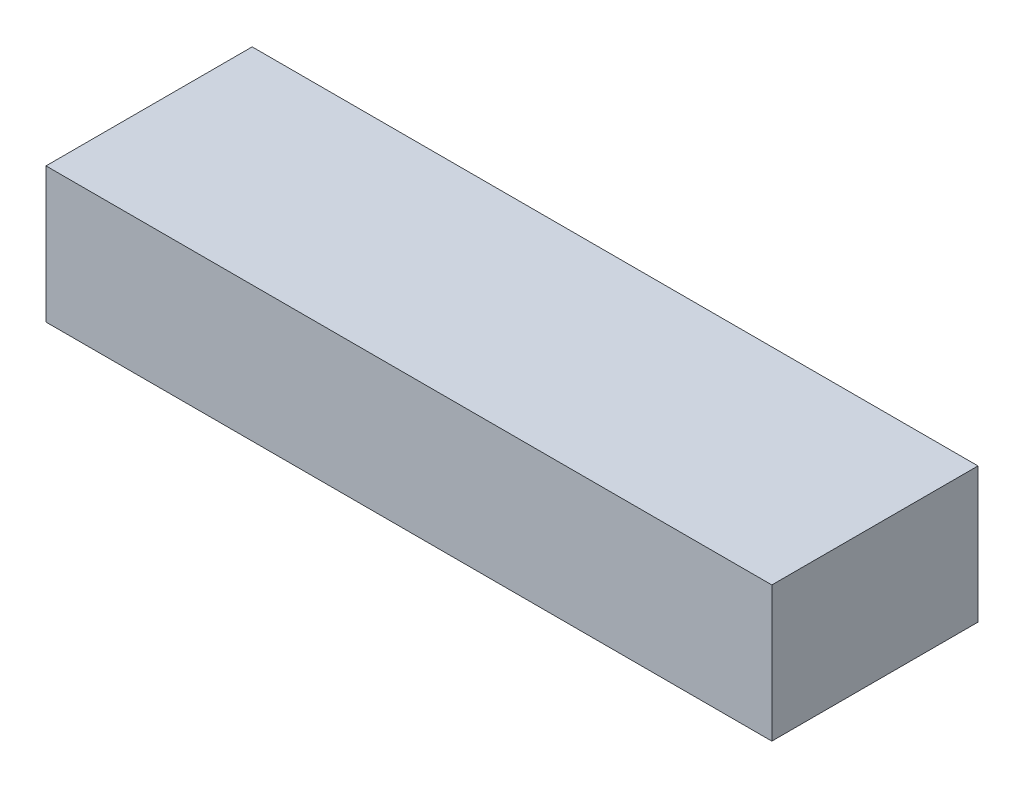
ISO-10303-21;
HEADER;
FILE_DESCRIPTION(('STEP AP214'),'2;1');
FILE_NAME('part.step','',(''),(''),'','','');
FILE_SCHEMA(('AUTOMOTIVE_DESIGN { 1 0 10303 214 1 1 1 1 }'));
ENDSEC;
DATA;
#1=APPLICATION_CONTEXT('core data for automotive mechanical design processes');
#2=APPLICATION_PROTOCOL_DEFINITION('international standard','automotive_design',2000,#1);
#3=PRODUCT_CONTEXT('',#1,'mechanical');
#4=PRODUCT('Part','Part','',(#3));
#5=PRODUCT_RELATED_PRODUCT_CATEGORY('part','',(#4));
#6=PRODUCT_DEFINITION_FORMATION('','',#4);
#7=PRODUCT_DEFINITION_CONTEXT('part definition',#1,'design');
#8=PRODUCT_DEFINITION('design','',#6,#7);
#9=PRODUCT_DEFINITION_SHAPE('','',#8);
#10=(LENGTH_UNIT() NAMED_UNIT(*) SI_UNIT(.MILLI.,.METRE.));
#11=(NAMED_UNIT(*) PLANE_ANGLE_UNIT() SI_UNIT($,.RADIAN.));
#12=(NAMED_UNIT(*) SI_UNIT($,.STERADIAN.) SOLID_ANGLE_UNIT());
#13=UNCERTAINTY_MEASURE_WITH_UNIT(LENGTH_MEASURE(1.E-05),#10,'distance_accuracy_value','');
#14=(GEOMETRIC_REPRESENTATION_CONTEXT(3) GLOBAL_UNCERTAINTY_ASSIGNED_CONTEXT((#13)) GLOBAL_UNIT_ASSIGNED_CONTEXT((#10,
#11,#12)) REPRESENTATION_CONTEXT('',''));
#15=CARTESIAN_POINT('',(0.,0.,0.));
#16=DIRECTION('',(0.,0.,1.));
#17=DIRECTION('',(1.,0.,0.));
#18=AXIS2_PLACEMENT_3D('',#15,#16,#17);
#19=CARTESIAN_POINT('',(84.4999999999999,31.5,-24.));
#20=DIRECTION('',(-1.,0.,0.));
#21=DIRECTION('',(0.,0.,1.));
#22=AXIS2_PLACEMENT_3D('',#19,#20,#21);
#23=PLANE('',#22);
#24=DIRECTION('',(0.,0.,-1.));
#25=VECTOR('',#24,1.);
#26=CARTESIAN_POINT('',(84.4999999999999,0.,-24.));
#27=LINE('',#26,#25);
#28=CARTESIAN_POINT('',(84.4999999999999,0.,24.));
#29=VERTEX_POINT('',#28);
#30=CARTESIAN_POINT('',(84.4999999999999,0.,-24.));
#31=VERTEX_POINT('',#30);
#32=EDGE_CURVE('E108',#29,#31,#27,.T.);
#33=ORIENTED_EDGE('',*,*,#32,.T.);
#34=DIRECTION('',(0.,-1.,0.));
#35=VECTOR('',#34,1.);
#36=CARTESIAN_POINT('',(84.4999999999999,31.5,-24.));
#37=LINE('',#36,#35);
#38=CARTESIAN_POINT('',(84.4999999999999,31.5,-24.));
#39=VERTEX_POINT('',#38);
#40=EDGE_CURVE('E11',#39,#31,#37,.T.);
#41=ORIENTED_EDGE('',*,*,#40,.F.);
#42=DIRECTION('',(0.,0.,-1.));
#43=VECTOR('',#42,1.);
#44=CARTESIAN_POINT('',(84.4999999999999,31.5,-24.));
#45=LINE('',#44,#43);
#46=CARTESIAN_POINT('',(84.4999999999999,31.5,24.));
#47=VERTEX_POINT('',#46);
#48=EDGE_CURVE('E96',#47,#39,#45,.T.);
#49=ORIENTED_EDGE('',*,*,#48,.F.);
#50=DIRECTION('',(0.,-1.,0.));
#51=VECTOR('',#50,1.);
#52=CARTESIAN_POINT('',(84.4999999999999,31.5,24.));
#53=LINE('',#52,#51);
#54=EDGE_CURVE('E104',#47,#29,#53,.T.);
#55=ORIENTED_EDGE('',*,*,#54,.T.);
#56=EDGE_LOOP('',(#33,#41,#49,#55));
#57=FACE_BOUND('',#56,.T.);
#58=ADVANCED_FACE('F45',(#57),#23,.F.);
#59=CARTESIAN_POINT('',(-84.5000000000001,31.5,-24.));
#60=DIRECTION('',(0.,0.,1.));
#61=DIRECTION('',(1.,0.,0.));
#62=AXIS2_PLACEMENT_3D('',#59,#60,#61);
#63=PLANE('',#62);
#64=DIRECTION('',(-1.,0.,0.));
#65=VECTOR('',#64,1.);
#66=CARTESIAN_POINT('',(-84.5000000000001,0.,-24.));
#67=LINE('',#66,#65);
#68=CARTESIAN_POINT('',(-84.5000000000001,0.,-24.));
#69=VERTEX_POINT('',#68);
#70=EDGE_CURVE('E100',#31,#69,#67,.T.);
#71=ORIENTED_EDGE('',*,*,#70,.T.);
#72=DIRECTION('',(0.,-1.,0.));
#73=VECTOR('',#72,1.);
#74=CARTESIAN_POINT('',(-84.5000000000001,31.5,-24.));
#75=LINE('',#74,#73);
#76=CARTESIAN_POINT('',(-84.5000000000001,31.5,-24.));
#77=VERTEX_POINT('',#76);
#78=EDGE_CURVE('E53',#77,#69,#75,.T.);
#79=ORIENTED_EDGE('',*,*,#78,.F.);
#80=DIRECTION('',(-1.,0.,0.));
#81=VECTOR('',#80,1.);
#82=CARTESIAN_POINT('',(-84.5000000000001,31.5,-24.));
#83=LINE('',#82,#81);
#84=EDGE_CURVE('E91',#39,#77,#83,.T.);
#85=ORIENTED_EDGE('',*,*,#84,.F.);
#86=ORIENTED_EDGE('',*,*,#40,.T.);
#87=EDGE_LOOP('',(#71,#79,#85,#86));
#88=FACE_BOUND('',#87,.T.);
#89=ADVANCED_FACE('F99',(#88),#63,.F.);
#90=CARTESIAN_POINT('',(-84.5000000000001,31.5,-24.));
#91=DIRECTION('',(1.,0.,0.));
#92=DIRECTION('',(0.,0.,-1.));
#93=AXIS2_PLACEMENT_3D('',#90,#91,#92);
#94=PLANE('',#93);
#95=DIRECTION('',(0.,0.,1.));
#96=VECTOR('',#95,1.);
#97=CARTESIAN_POINT('',(-84.5000000000001,0.,-24.));
#98=LINE('',#97,#96);
#99=CARTESIAN_POINT('',(-84.5000000000001,0.,24.));
#100=VERTEX_POINT('',#99);
#101=EDGE_CURVE('E78',#69,#100,#98,.T.);
#102=ORIENTED_EDGE('',*,*,#101,.T.);
#103=DIRECTION('',(0.,-1.,0.));
#104=VECTOR('',#103,1.);
#105=CARTESIAN_POINT('',(-84.5000000000001,31.5,24.));
#106=LINE('',#105,#104);
#107=CARTESIAN_POINT('',(-84.5000000000001,31.5,24.));
#108=VERTEX_POINT('',#107);
#109=EDGE_CURVE('E101',#108,#100,#106,.T.);
#110=ORIENTED_EDGE('',*,*,#109,.F.);
#111=DIRECTION('',(0.,0.,1.));
#112=VECTOR('',#111,1.);
#113=CARTESIAN_POINT('',(-84.5000000000001,31.5,-24.));
#114=LINE('',#113,#112);
#115=EDGE_CURVE('E94',#77,#108,#114,.T.);
#116=ORIENTED_EDGE('',*,*,#115,.F.);
#117=ORIENTED_EDGE('',*,*,#78,.T.);
#118=EDGE_LOOP('',(#102,#110,#116,#117));
#119=FACE_BOUND('',#118,.T.);
#120=ADVANCED_FACE('F102',(#119),#94,.F.);
#121=CARTESIAN_POINT('',(-84.5000000000001,31.5,24.));
#122=DIRECTION('',(0.,0.,-1.));
#123=DIRECTION('',(-1.,0.,0.));
#124=AXIS2_PLACEMENT_3D('',#121,#122,#123);
#125=PLANE('',#124);
#126=DIRECTION('',(1.,0.,0.));
#127=VECTOR('',#126,1.);
#128=CARTESIAN_POINT('',(-84.5000000000001,0.,24.));
#129=LINE('',#128,#127);
#130=EDGE_CURVE('E84',#100,#29,#129,.T.);
#131=ORIENTED_EDGE('',*,*,#130,.T.);
#132=ORIENTED_EDGE('',*,*,#54,.F.);
#133=DIRECTION('',(1.,0.,0.));
#134=VECTOR('',#133,1.);
#135=CARTESIAN_POINT('',(-84.5000000000001,31.5,24.));
#136=LINE('',#135,#134);
#137=EDGE_CURVE('E61',#108,#47,#136,.T.);
#138=ORIENTED_EDGE('',*,*,#137,.F.);
#139=ORIENTED_EDGE('',*,*,#109,.T.);
#140=EDGE_LOOP('',(#131,#132,#138,#139));
#141=FACE_BOUND('',#140,.T.);
#142=ADVANCED_FACE('F115',(#141),#125,.F.);
#143=CARTESIAN_POINT('',(0.,31.5,0.));
#144=DIRECTION('',(0.,1.,0.));
#145=DIRECTION('',(0.,0.,1.));
#146=AXIS2_PLACEMENT_3D('',#143,#144,#145);
#147=PLANE('',#146);
#148=ORIENTED_EDGE('',*,*,#48,.T.);
#149=ORIENTED_EDGE('',*,*,#84,.T.);
#150=ORIENTED_EDGE('',*,*,#115,.T.);
#151=ORIENTED_EDGE('',*,*,#137,.T.);
#152=EDGE_LOOP('',(#148,#149,#150,#151));
#153=FACE_BOUND('',#152,.T.);
#154=ADVANCED_FACE('F92',(#153),#147,.T.);
#155=CARTESIAN_POINT('',(0.,0.,0.));
#156=DIRECTION('',(0.,1.,0.));
#157=DIRECTION('',(0.,0.,1.));
#158=AXIS2_PLACEMENT_3D('',#155,#156,#157);
#159=PLANE('',#158);
#160=ORIENTED_EDGE('',*,*,#32,.F.);
#161=ORIENTED_EDGE('',*,*,#130,.F.);
#162=ORIENTED_EDGE('',*,*,#101,.F.);
#163=ORIENTED_EDGE('',*,*,#70,.F.);
#164=EDGE_LOOP('',(#160,#161,#162,#163));
#165=FACE_BOUND('',#164,.T.);
#166=ADVANCED_FACE('F118',(#165),#159,.F.);
#167=CLOSED_SHELL('',(#58,#89,#120,#142,#154,#166));
#168=MANIFOLD_SOLID_BREP('B2',#167);
#169=ADVANCED_BREP_SHAPE_REPRESENTATION('',(#18,#168),#14);
#170=SHAPE_DEFINITION_REPRESENTATION(#9,#169);
ENDSEC;
END-ISO-10303-21;
